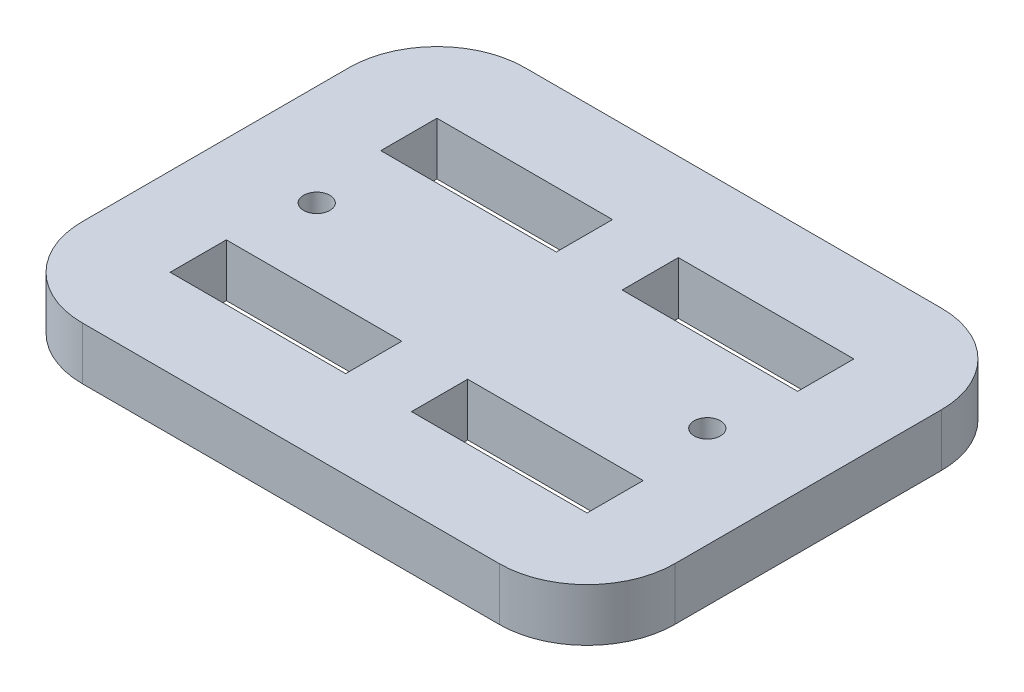
ISO-10303-21;
HEADER;
FILE_DESCRIPTION(('STEP AP214'),'2;1');
FILE_NAME('part.step','',(''),(''),'','','');
FILE_SCHEMA(('AUTOMOTIVE_DESIGN { 1 0 10303 214 1 1 1 1 }'));
ENDSEC;
DATA;
#1=APPLICATION_CONTEXT('core data for automotive mechanical design processes');
#2=APPLICATION_PROTOCOL_DEFINITION('international standard','automotive_design',2000,#1);
#3=PRODUCT_CONTEXT('',#1,'mechanical');
#4=PRODUCT('Part','Part','',(#3));
#5=PRODUCT_RELATED_PRODUCT_CATEGORY('part','',(#4));
#6=PRODUCT_DEFINITION_FORMATION('','',#4);
#7=PRODUCT_DEFINITION_CONTEXT('part definition',#1,'design');
#8=PRODUCT_DEFINITION('design','',#6,#7);
#9=PRODUCT_DEFINITION_SHAPE('','',#8);
#10=(LENGTH_UNIT() NAMED_UNIT(*) SI_UNIT(.MILLI.,.METRE.));
#11=(NAMED_UNIT(*) PLANE_ANGLE_UNIT() SI_UNIT($,.RADIAN.));
#12=(NAMED_UNIT(*) SI_UNIT($,.STERADIAN.) SOLID_ANGLE_UNIT());
#13=UNCERTAINTY_MEASURE_WITH_UNIT(LENGTH_MEASURE(1.E-05),#10,'distance_accuracy_value','');
#14=(GEOMETRIC_REPRESENTATION_CONTEXT(3) GLOBAL_UNCERTAINTY_ASSIGNED_CONTEXT((#13)) GLOBAL_UNIT_ASSIGNED_CONTEXT((#10,
#11,#12)) REPRESENTATION_CONTEXT('',''));
#15=CARTESIAN_POINT('',(0.,0.,0.));
#16=DIRECTION('',(0.,0.,1.));
#17=DIRECTION('',(1.,0.,0.));
#18=AXIS2_PLACEMENT_3D('',#15,#16,#17);
#19=CARTESIAN_POINT('',(0.,6.,0.));
#20=DIRECTION('',(0.,1.,0.));
#21=DIRECTION('',(0.,0.,1.));
#22=AXIS2_PLACEMENT_3D('',#19,#20,#21);
#23=PLANE('',#22);
#24=DIRECTION('',(1.,0.,0.));
#25=VECTOR('',#24,1.);
#26=CARTESIAN_POINT('',(-23.75,6.,15.2));
#27=LINE('',#26,#25);
#28=CARTESIAN_POINT('',(-23.75,6.,15.2));
#29=VERTEX_POINT('',#28);
#30=CARTESIAN_POINT('',(-3.75,6.,15.2));
#31=VERTEX_POINT('',#30);
#32=EDGE_CURVE('E286',#29,#31,#27,.T.);
#33=ORIENTED_EDGE('',*,*,#32,.F.);
#34=DIRECTION('',(0.,0.,1.));
#35=VECTOR('',#34,1.);
#36=CARTESIAN_POINT('',(-23.75,6.,15.2));
#37=LINE('',#36,#35);
#38=CARTESIAN_POINT('',(-23.75,6.,8.8));
#39=VERTEX_POINT('',#38);
#40=EDGE_CURVE('E284',#39,#29,#37,.T.);
#41=ORIENTED_EDGE('',*,*,#40,.F.);
#42=DIRECTION('',(-1.,0.,0.));
#43=VECTOR('',#42,1.);
#44=CARTESIAN_POINT('',(-23.75,6.,8.8));
#45=LINE('',#44,#43);
#46=CARTESIAN_POINT('',(-3.75,6.,8.8));
#47=VERTEX_POINT('',#46);
#48=EDGE_CURVE('E292',#47,#39,#45,.T.);
#49=ORIENTED_EDGE('',*,*,#48,.F.);
#50=DIRECTION('',(0.,0.,-1.));
#51=VECTOR('',#50,1.);
#52=CARTESIAN_POINT('',(-3.75,6.,15.2));
#53=LINE('',#52,#51);
#54=EDGE_CURVE('E289',#31,#47,#53,.T.);
#55=ORIENTED_EDGE('',*,*,#54,.F.);
#56=EDGE_LOOP('',(#33,#41,#49,#55));
#57=FACE_BOUND('',#56,.T.);
#58=DIRECTION('',(-1.,0.,0.));
#59=VECTOR('',#58,1.);
#60=CARTESIAN_POINT('',(-23.75,6.,-15.2));
#61=LINE('',#60,#59);
#62=CARTESIAN_POINT('',(-3.75,6.,-15.2));
#63=VERTEX_POINT('',#62);
#64=CARTESIAN_POINT('',(-23.75,6.,-15.2));
#65=VERTEX_POINT('',#64);
#66=EDGE_CURVE('E317',#63,#65,#61,.T.);
#67=ORIENTED_EDGE('',*,*,#66,.F.);
#68=DIRECTION('',(0.,0.,-1.));
#69=VECTOR('',#68,1.);
#70=CARTESIAN_POINT('',(-3.75,6.,-15.2));
#71=LINE('',#70,#69);
#72=CARTESIAN_POINT('',(-3.75,6.,-8.8));
#73=VERTEX_POINT('',#72);
#74=EDGE_CURVE('E315',#73,#63,#71,.T.);
#75=ORIENTED_EDGE('',*,*,#74,.F.);
#76=DIRECTION('',(1.,0.,0.));
#77=VECTOR('',#76,1.);
#78=CARTESIAN_POINT('',(-23.75,6.,-8.8));
#79=LINE('',#78,#77);
#80=CARTESIAN_POINT('',(-23.75,6.,-8.8));
#81=VERTEX_POINT('',#80);
#82=EDGE_CURVE('E323',#81,#73,#79,.T.);
#83=ORIENTED_EDGE('',*,*,#82,.F.);
#84=DIRECTION('',(0.,0.,1.));
#85=VECTOR('',#84,1.);
#86=CARTESIAN_POINT('',(-23.75,6.,-15.2));
#87=LINE('',#86,#85);
#88=EDGE_CURVE('E320',#65,#81,#87,.T.);
#89=ORIENTED_EDGE('',*,*,#88,.F.);
#90=EDGE_LOOP('',(#67,#75,#83,#89));
#91=FACE_BOUND('',#90,.T.);
#92=DIRECTION('',(1.,0.,0.));
#93=VECTOR('',#92,1.);
#94=CARTESIAN_POINT('',(-33.75,6.,25.2));
#95=LINE('',#94,#93);
#96=CARTESIAN_POINT('',(-23.75,6.,25.2));
#97=VERTEX_POINT('',#96);
#98=CARTESIAN_POINT('',(23.75,6.,25.2));
#99=VERTEX_POINT('',#98);
#100=EDGE_CURVE('E349',#97,#99,#95,.T.);
#101=ORIENTED_EDGE('',*,*,#100,.T.);
#102=CARTESIAN_POINT('',(23.75,6.,15.2));
#103=DIRECTION('',(0.,1.,0.));
#104=DIRECTION('',(0.,0.,1.));
#105=AXIS2_PLACEMENT_3D('',#102,#103,#104);
#106=CIRCLE('',#105,10.);
#107=CARTESIAN_POINT('',(33.75,6.,15.2));
#108=VERTEX_POINT('',#107);
#109=EDGE_CURVE('E40',#99,#108,#106,.T.);
#110=ORIENTED_EDGE('',*,*,#109,.T.);
#111=DIRECTION('',(0.,0.,1.));
#112=VECTOR('',#111,1.);
#113=CARTESIAN_POINT('',(33.75,6.,-25.2));
#114=LINE('',#113,#112);
#115=CARTESIAN_POINT('',(33.75,6.,-15.2));
#116=VERTEX_POINT('',#115);
#117=EDGE_CURVE('E272',#116,#108,#114,.T.);
#118=ORIENTED_EDGE('',*,*,#117,.F.);
#119=CARTESIAN_POINT('',(23.75,6.,-15.2));
#120=DIRECTION('',(0.,1.,0.));
#121=DIRECTION('',(0.,0.,1.));
#122=AXIS2_PLACEMENT_3D('',#119,#120,#121);
#123=CIRCLE('',#122,10.);
#124=CARTESIAN_POINT('',(23.75,6.,-25.2));
#125=VERTEX_POINT('',#124);
#126=EDGE_CURVE('E47',#116,#125,#123,.T.);
#127=ORIENTED_EDGE('',*,*,#126,.T.);
#128=DIRECTION('',(-1.,0.,0.));
#129=VECTOR('',#128,1.);
#130=CARTESIAN_POINT('',(-33.75,6.,-25.2));
#131=LINE('',#130,#129);
#132=CARTESIAN_POINT('',(-23.75,6.,-25.2));
#133=VERTEX_POINT('',#132);
#134=EDGE_CURVE('E352',#125,#133,#131,.T.);
#135=ORIENTED_EDGE('',*,*,#134,.T.);
#136=CARTESIAN_POINT('',(-23.75,6.,-15.2));
#137=DIRECTION('',(0.,1.,0.));
#138=DIRECTION('',(0.,0.,1.));
#139=AXIS2_PLACEMENT_3D('',#136,#137,#138);
#140=CIRCLE('',#139,10.);
#141=CARTESIAN_POINT('',(-33.75,6.,-15.2));
#142=VERTEX_POINT('',#141);
#143=EDGE_CURVE('E372',#133,#142,#140,.T.);
#144=ORIENTED_EDGE('',*,*,#143,.T.);
#145=DIRECTION('',(0.,0.,1.));
#146=VECTOR('',#145,1.);
#147=CARTESIAN_POINT('',(-33.75,6.,-25.2));
#148=LINE('',#147,#146);
#149=CARTESIAN_POINT('',(-33.75,6.,15.2));
#150=VERTEX_POINT('',#149);
#151=EDGE_CURVE('E346',#142,#150,#148,.T.);
#152=ORIENTED_EDGE('',*,*,#151,.T.);
#153=CARTESIAN_POINT('',(-23.75,6.,15.2));
#154=DIRECTION('',(0.,1.,0.));
#155=DIRECTION('',(0.,0.,1.));
#156=AXIS2_PLACEMENT_3D('',#153,#154,#155);
#157=CIRCLE('',#156,10.);
#158=EDGE_CURVE('E374',#150,#97,#157,.T.);
#159=ORIENTED_EDGE('',*,*,#158,.T.);
#160=EDGE_LOOP('',(#101,#110,#118,#127,#135,#144,#152,#159));
#161=FACE_BOUND('',#160,.T.);
#162=CARTESIAN_POINT('',(-22.25,6.,0.));
#163=DIRECTION('',(0.,1.,0.));
#164=DIRECTION('',(0.,0.,-1.));
#165=AXIS2_PLACEMENT_3D('',#162,#163,#164);
#166=CIRCLE('',#165,1.5);
#167=CARTESIAN_POINT('',(-22.25,6.,-1.5));
#168=VERTEX_POINT('',#167);
#169=EDGE_CURVE('E278',#168,#168,#166,.T.);
#170=ORIENTED_EDGE('',*,*,#169,.F.);
#171=EDGE_LOOP('',(#170));
#172=FACE_BOUND('',#171,.T.);
#173=CARTESIAN_POINT('',(22.25,6.,0.));
#174=DIRECTION('',(0.,-1.,0.));
#175=DIRECTION('',(0.,0.,-1.));
#176=AXIS2_PLACEMENT_3D('',#173,#174,#175);
#177=CIRCLE('',#176,1.5);
#178=CARTESIAN_POINT('',(22.25,6.,-1.5));
#179=VERTEX_POINT('',#178);
#180=EDGE_CURVE('E229',#179,#179,#177,.T.);
#181=ORIENTED_EDGE('',*,*,#180,.T.);
#182=EDGE_LOOP('',(#181));
#183=FACE_BOUND('',#182,.T.);
#184=DIRECTION('',(0.,0.,1.));
#185=VECTOR('',#184,1.);
#186=CARTESIAN_POINT('',(23.75,6.,15.2));
#187=LINE('',#186,#185);
#188=CARTESIAN_POINT('',(23.75,6.,8.8));
#189=VERTEX_POINT('',#188);
#190=CARTESIAN_POINT('',(23.75,6.,15.2));
#191=VERTEX_POINT('',#190);
#192=EDGE_CURVE('E210',#189,#191,#187,.T.);
#193=ORIENTED_EDGE('',*,*,#192,.T.);
#194=DIRECTION('',(-1.,0.,0.));
#195=VECTOR('',#194,1.);
#196=CARTESIAN_POINT('',(23.75,6.,15.2));
#197=LINE('',#196,#195);
#198=CARTESIAN_POINT('',(3.75,6.,15.2));
#199=VERTEX_POINT('',#198);
#200=EDGE_CURVE('E222',#191,#199,#197,.T.);
#201=ORIENTED_EDGE('',*,*,#200,.T.);
#202=DIRECTION('',(0.,0.,-1.));
#203=VECTOR('',#202,1.);
#204=CARTESIAN_POINT('',(3.75,6.,15.2));
#205=LINE('',#204,#203);
#206=CARTESIAN_POINT('',(3.75,6.,8.8));
#207=VERTEX_POINT('',#206);
#208=EDGE_CURVE('E220',#199,#207,#205,.T.);
#209=ORIENTED_EDGE('',*,*,#208,.T.);
#210=DIRECTION('',(1.,0.,0.));
#211=VECTOR('',#210,1.);
#212=CARTESIAN_POINT('',(23.75,6.,8.8));
#213=LINE('',#212,#211);
#214=EDGE_CURVE('E200',#207,#189,#213,.T.);
#215=ORIENTED_EDGE('',*,*,#214,.T.);
#216=EDGE_LOOP('',(#193,#201,#209,#215));
#217=FACE_BOUND('',#216,.T.);
#218=DIRECTION('',(0.,0.,-1.));
#219=VECTOR('',#218,1.);
#220=CARTESIAN_POINT('',(3.75,6.,-15.2));
#221=LINE('',#220,#219);
#222=CARTESIAN_POINT('',(3.75,6.,-8.8));
#223=VERTEX_POINT('',#222);
#224=CARTESIAN_POINT('',(3.75,6.,-15.2));
#225=VERTEX_POINT('',#224);
#226=EDGE_CURVE('E240',#223,#225,#221,.T.);
#227=ORIENTED_EDGE('',*,*,#226,.T.);
#228=DIRECTION('',(1.,0.,0.));
#229=VECTOR('',#228,1.);
#230=CARTESIAN_POINT('',(23.75,6.,-15.2));
#231=LINE('',#230,#229);
#232=CARTESIAN_POINT('',(23.75,6.,-15.2));
#233=VERTEX_POINT('',#232);
#234=EDGE_CURVE('E250',#225,#233,#231,.T.);
#235=ORIENTED_EDGE('',*,*,#234,.T.);
#236=DIRECTION('',(0.,0.,1.));
#237=VECTOR('',#236,1.);
#238=CARTESIAN_POINT('',(23.75,6.,-15.2));
#239=LINE('',#238,#237);
#240=CARTESIAN_POINT('',(23.75,6.,-8.8));
#241=VERTEX_POINT('',#240);
#242=EDGE_CURVE('E247',#233,#241,#239,.T.);
#243=ORIENTED_EDGE('',*,*,#242,.T.);
#244=DIRECTION('',(-1.,0.,0.));
#245=VECTOR('',#244,1.);
#246=CARTESIAN_POINT('',(23.75,6.,-8.8));
#247=LINE('',#246,#245);
#248=EDGE_CURVE('E243',#241,#223,#247,.T.);
#249=ORIENTED_EDGE('',*,*,#248,.T.);
#250=EDGE_LOOP('',(#227,#235,#243,#249));
#251=FACE_BOUND('',#250,.T.);
#252=ADVANCED_FACE('F32',(#57,#91,#161,#172,#183,#217,#251),#23,.T.);
#253=CARTESIAN_POINT('',(0.,0.,0.));
#254=DIRECTION('',(0.,1.,0.));
#255=DIRECTION('',(0.,0.,1.));
#256=AXIS2_PLACEMENT_3D('',#253,#254,#255);
#257=PLANE('',#256);
#258=DIRECTION('',(0.,0.,-1.));
#259=VECTOR('',#258,1.);
#260=CARTESIAN_POINT('',(-3.75,0.,-15.2));
#261=LINE('',#260,#259);
#262=CARTESIAN_POINT('',(-3.75,0.,-8.8));
#263=VERTEX_POINT('',#262);
#264=CARTESIAN_POINT('',(-3.75,0.,-15.2));
#265=VERTEX_POINT('',#264);
#266=EDGE_CURVE('E314',#263,#265,#261,.T.);
#267=ORIENTED_EDGE('',*,*,#266,.T.);
#268=DIRECTION('',(-1.,0.,0.));
#269=VECTOR('',#268,1.);
#270=CARTESIAN_POINT('',(-23.75,0.,-15.2));
#271=LINE('',#270,#269);
#272=CARTESIAN_POINT('',(-23.75,0.,-15.2));
#273=VERTEX_POINT('',#272);
#274=EDGE_CURVE('E328',#265,#273,#271,.T.);
#275=ORIENTED_EDGE('',*,*,#274,.T.);
#276=DIRECTION('',(0.,0.,1.));
#277=VECTOR('',#276,1.);
#278=CARTESIAN_POINT('',(-23.75,0.,-15.2));
#279=LINE('',#278,#277);
#280=CARTESIAN_POINT('',(-23.75,0.,-8.8));
#281=VERTEX_POINT('',#280);
#282=EDGE_CURVE('E331',#273,#281,#279,.T.);
#283=ORIENTED_EDGE('',*,*,#282,.T.);
#284=DIRECTION('',(1.,0.,0.));
#285=VECTOR('',#284,1.);
#286=CARTESIAN_POINT('',(-23.75,0.,-8.8));
#287=LINE('',#286,#285);
#288=EDGE_CURVE('E318',#281,#263,#287,.T.);
#289=ORIENTED_EDGE('',*,*,#288,.T.);
#290=EDGE_LOOP('',(#267,#275,#283,#289));
#291=FACE_BOUND('',#290,.T.);
#292=DIRECTION('',(0.,0.,1.));
#293=VECTOR('',#292,1.);
#294=CARTESIAN_POINT('',(33.75,0.,-25.2));
#295=LINE('',#294,#293);
#296=CARTESIAN_POINT('',(33.75,0.,-15.2));
#297=VERTEX_POINT('',#296);
#298=CARTESIAN_POINT('',(33.75,0.,15.2));
#299=VERTEX_POINT('',#298);
#300=EDGE_CURVE('E271',#297,#299,#295,.T.);
#301=ORIENTED_EDGE('',*,*,#300,.T.);
#302=CARTESIAN_POINT('',(23.75,0.,15.2));
#303=DIRECTION('',(0.,1.,0.));
#304=DIRECTION('',(0.,0.,1.));
#305=AXIS2_PLACEMENT_3D('',#302,#303,#304);
#306=CIRCLE('',#305,10.);
#307=CARTESIAN_POINT('',(23.75,0.,25.2));
#308=VERTEX_POINT('',#307);
#309=EDGE_CURVE('E386',#299,#308,#306,.F.);
#310=ORIENTED_EDGE('',*,*,#309,.T.);
#311=DIRECTION('',(1.,0.,0.));
#312=VECTOR('',#311,1.);
#313=CARTESIAN_POINT('',(-33.75,0.,25.2));
#314=LINE('',#313,#312);
#315=CARTESIAN_POINT('',(-23.75,0.,25.2));
#316=VERTEX_POINT('',#315);
#317=EDGE_CURVE('E357',#316,#308,#314,.T.);
#318=ORIENTED_EDGE('',*,*,#317,.F.);
#319=CARTESIAN_POINT('',(-23.75,0.,15.2));
#320=DIRECTION('',(0.,1.,0.));
#321=DIRECTION('',(0.,0.,1.));
#322=AXIS2_PLACEMENT_3D('',#319,#320,#321);
#323=CIRCLE('',#322,10.);
#324=CARTESIAN_POINT('',(-33.75,0.,15.2));
#325=VERTEX_POINT('',#324);
#326=EDGE_CURVE('E365',#316,#325,#323,.F.);
#327=ORIENTED_EDGE('',*,*,#326,.T.);
#328=DIRECTION('',(0.,0.,1.));
#329=VECTOR('',#328,1.);
#330=CARTESIAN_POINT('',(-33.75,0.,-25.2));
#331=LINE('',#330,#329);
#332=CARTESIAN_POINT('',(-33.75,0.,-15.2));
#333=VERTEX_POINT('',#332);
#334=EDGE_CURVE('E345',#333,#325,#331,.T.);
#335=ORIENTED_EDGE('',*,*,#334,.F.);
#336=CARTESIAN_POINT('',(-23.75,0.,-15.2));
#337=DIRECTION('',(0.,1.,0.));
#338=DIRECTION('',(0.,0.,1.));
#339=AXIS2_PLACEMENT_3D('',#336,#337,#338);
#340=CIRCLE('',#339,10.);
#341=CARTESIAN_POINT('',(-23.75,0.,-25.2));
#342=VERTEX_POINT('',#341);
#343=EDGE_CURVE('E362',#333,#342,#340,.F.);
#344=ORIENTED_EDGE('',*,*,#343,.T.);
#345=DIRECTION('',(-1.,0.,0.));
#346=VECTOR('',#345,1.);
#347=CARTESIAN_POINT('',(-33.75,0.,-25.2));
#348=LINE('',#347,#346);
#349=CARTESIAN_POINT('',(23.75,0.,-25.2));
#350=VERTEX_POINT('',#349);
#351=EDGE_CURVE('E350',#350,#342,#348,.T.);
#352=ORIENTED_EDGE('',*,*,#351,.F.);
#353=CARTESIAN_POINT('',(23.75,0.,-15.2));
#354=DIRECTION('',(0.,1.,0.));
#355=DIRECTION('',(0.,0.,1.));
#356=AXIS2_PLACEMENT_3D('',#353,#354,#355);
#357=CIRCLE('',#356,10.);
#358=EDGE_CURVE('E384',#350,#297,#357,.F.);
#359=ORIENTED_EDGE('',*,*,#358,.T.);
#360=EDGE_LOOP('',(#301,#310,#318,#327,#335,#344,#352,#359));
#361=FACE_BOUND('',#360,.T.);
#362=DIRECTION('',(0.,0.,1.));
#363=VECTOR('',#362,1.);
#364=CARTESIAN_POINT('',(-23.75,0.,15.2));
#365=LINE('',#364,#363);
#366=CARTESIAN_POINT('',(-23.75,0.,8.8));
#367=VERTEX_POINT('',#366);
#368=CARTESIAN_POINT('',(-23.75,0.,15.2));
#369=VERTEX_POINT('',#368);
#370=EDGE_CURVE('E281',#367,#369,#365,.T.);
#371=ORIENTED_EDGE('',*,*,#370,.T.);
#372=DIRECTION('',(1.,0.,0.));
#373=VECTOR('',#372,1.);
#374=CARTESIAN_POINT('',(-23.75,0.,15.2));
#375=LINE('',#374,#373);
#376=CARTESIAN_POINT('',(-3.75,0.,15.2));
#377=VERTEX_POINT('',#376);
#378=EDGE_CURVE('E297',#369,#377,#375,.T.);
#379=ORIENTED_EDGE('',*,*,#378,.T.);
#380=DIRECTION('',(0.,0.,-1.));
#381=VECTOR('',#380,1.);
#382=CARTESIAN_POINT('',(-3.75,0.,15.2));
#383=LINE('',#382,#381);
#384=CARTESIAN_POINT('',(-3.75,0.,8.8));
#385=VERTEX_POINT('',#384);
#386=EDGE_CURVE('E300',#377,#385,#383,.T.);
#387=ORIENTED_EDGE('',*,*,#386,.T.);
#388=DIRECTION('',(-1.,0.,0.));
#389=VECTOR('',#388,1.);
#390=CARTESIAN_POINT('',(-23.75,0.,8.8));
#391=LINE('',#390,#389);
#392=EDGE_CURVE('E287',#385,#367,#391,.T.);
#393=ORIENTED_EDGE('',*,*,#392,.T.);
#394=EDGE_LOOP('',(#371,#379,#387,#393));
#395=FACE_BOUND('',#394,.T.);
#396=CARTESIAN_POINT('',(-22.25,0.,0.));
#397=DIRECTION('',(0.,1.,0.));
#398=DIRECTION('',(0.,0.,-1.));
#399=AXIS2_PLACEMENT_3D('',#396,#397,#398);
#400=CIRCLE('',#399,1.5);
#401=CARTESIAN_POINT('',(-22.25,0.,-1.5));
#402=VERTEX_POINT('',#401);
#403=EDGE_CURVE('E275',#402,#402,#400,.T.);
#404=ORIENTED_EDGE('',*,*,#403,.T.);
#405=EDGE_LOOP('',(#404));
#406=FACE_BOUND('',#405,.T.);
#407=CARTESIAN_POINT('',(22.25,0.,0.));
#408=DIRECTION('',(0.,-1.,0.));
#409=DIRECTION('',(0.,0.,-1.));
#410=AXIS2_PLACEMENT_3D('',#407,#408,#409);
#411=CIRCLE('',#410,1.5);
#412=CARTESIAN_POINT('',(22.25,0.,-1.5));
#413=VERTEX_POINT('',#412);
#414=EDGE_CURVE('E694',#413,#413,#411,.T.);
#415=ORIENTED_EDGE('',*,*,#414,.F.);
#416=EDGE_LOOP('',(#415));
#417=FACE_BOUND('',#416,.T.);
#418=DIRECTION('',(-1.,0.,0.));
#419=VECTOR('',#418,1.);
#420=CARTESIAN_POINT('',(23.75,0.,15.2));
#421=LINE('',#420,#419);
#422=CARTESIAN_POINT('',(23.75,0.,15.2));
#423=VERTEX_POINT('',#422);
#424=CARTESIAN_POINT('',(3.75,0.,15.2));
#425=VERTEX_POINT('',#424);
#426=EDGE_CURVE('E217',#423,#425,#421,.T.);
#427=ORIENTED_EDGE('',*,*,#426,.F.);
#428=DIRECTION('',(0.,0.,1.));
#429=VECTOR('',#428,1.);
#430=CARTESIAN_POINT('',(23.75,0.,15.2));
#431=LINE('',#430,#429);
#432=CARTESIAN_POINT('',(23.75,0.,8.8));
#433=VERTEX_POINT('',#432);
#434=EDGE_CURVE('E227',#433,#423,#431,.T.);
#435=ORIENTED_EDGE('',*,*,#434,.F.);
#436=DIRECTION('',(1.,0.,0.));
#437=VECTOR('',#436,1.);
#438=CARTESIAN_POINT('',(23.75,0.,8.8));
#439=LINE('',#438,#437);
#440=CARTESIAN_POINT('',(3.75,0.,8.8));
#441=VERTEX_POINT('',#440);
#442=EDGE_CURVE('E203',#441,#433,#439,.T.);
#443=ORIENTED_EDGE('',*,*,#442,.F.);
#444=DIRECTION('',(0.,0.,-1.));
#445=VECTOR('',#444,1.);
#446=CARTESIAN_POINT('',(3.75,0.,15.2));
#447=LINE('',#446,#445);
#448=EDGE_CURVE('E231',#425,#441,#447,.T.);
#449=ORIENTED_EDGE('',*,*,#448,.F.);
#450=EDGE_LOOP('',(#427,#435,#443,#449));
#451=FACE_BOUND('',#450,.T.);
#452=DIRECTION('',(1.,0.,0.));
#453=VECTOR('',#452,1.);
#454=CARTESIAN_POINT('',(23.75,0.,-15.2));
#455=LINE('',#454,#453);
#456=CARTESIAN_POINT('',(3.75,0.,-15.2));
#457=VERTEX_POINT('',#456);
#458=CARTESIAN_POINT('',(23.75,0.,-15.2));
#459=VERTEX_POINT('',#458);
#460=EDGE_CURVE('E244',#457,#459,#455,.T.);
#461=ORIENTED_EDGE('',*,*,#460,.F.);
#462=DIRECTION('',(0.,0.,-1.));
#463=VECTOR('',#462,1.);
#464=CARTESIAN_POINT('',(3.75,0.,-15.2));
#465=LINE('',#464,#463);
#466=CARTESIAN_POINT('',(3.75,0.,-8.8));
#467=VERTEX_POINT('',#466);
#468=EDGE_CURVE('E206',#467,#457,#465,.T.);
#469=ORIENTED_EDGE('',*,*,#468,.F.);
#470=DIRECTION('',(-1.,0.,0.));
#471=VECTOR('',#470,1.);
#472=CARTESIAN_POINT('',(23.75,0.,-8.8));
#473=LINE('',#472,#471);
#474=CARTESIAN_POINT('',(23.75,0.,-8.8));
#475=VERTEX_POINT('',#474);
#476=EDGE_CURVE('E255',#475,#467,#473,.T.);
#477=ORIENTED_EDGE('',*,*,#476,.F.);
#478=DIRECTION('',(0.,0.,1.));
#479=VECTOR('',#478,1.);
#480=CARTESIAN_POINT('',(23.75,0.,-15.2));
#481=LINE('',#480,#479);
#482=EDGE_CURVE('E258',#459,#475,#481,.T.);
#483=ORIENTED_EDGE('',*,*,#482,.F.);
#484=EDGE_LOOP('',(#461,#469,#477,#483));
#485=FACE_BOUND('',#484,.T.);
#486=ADVANCED_FACE('F400',(#291,#361,#395,#406,#417,#451,#485),#257,.F.);
#487=CARTESIAN_POINT('',(-33.75,6.,-25.2));
#488=DIRECTION('',(1.,0.,0.));
#489=DIRECTION('',(0.,0.,-1.));
#490=AXIS2_PLACEMENT_3D('',#487,#488,#489);
#491=PLANE('',#490);
#492=ORIENTED_EDGE('',*,*,#334,.T.);
#493=DIRECTION('',(0.,-1.,0.));
#494=VECTOR('',#493,1.);
#495=CARTESIAN_POINT('',(-33.75,6.,15.2));
#496=LINE('',#495,#494);
#497=EDGE_CURVE('E370',#325,#150,#496,.F.);
#498=ORIENTED_EDGE('',*,*,#497,.T.);
#499=ORIENTED_EDGE('',*,*,#151,.F.);
#500=DIRECTION('',(0.,-1.,0.));
#501=VECTOR('',#500,1.);
#502=CARTESIAN_POINT('',(-33.75,6.,-15.2));
#503=LINE('',#502,#501);
#504=EDGE_CURVE('E367',#142,#333,#503,.T.);
#505=ORIENTED_EDGE('',*,*,#504,.T.);
#506=EDGE_LOOP('',(#492,#498,#499,#505));
#507=FACE_BOUND('',#506,.T.);
#508=ADVANCED_FACE('F410',(#507),#491,.F.);
#509=CARTESIAN_POINT('',(-33.75,6.,25.2));
#510=DIRECTION('',(0.,0.,-1.));
#511=DIRECTION('',(-1.,0.,0.));
#512=AXIS2_PLACEMENT_3D('',#509,#510,#511);
#513=PLANE('',#512);
#514=ORIENTED_EDGE('',*,*,#317,.T.);
#515=DIRECTION('',(0.,-1.,0.));
#516=VECTOR('',#515,1.);
#517=CARTESIAN_POINT('',(23.75,6.,25.2));
#518=LINE('',#517,#516);
#519=EDGE_CURVE('E55',#308,#99,#518,.F.);
#520=ORIENTED_EDGE('',*,*,#519,.T.);
#521=ORIENTED_EDGE('',*,*,#100,.F.);
#522=DIRECTION('',(0.,-1.,0.));
#523=VECTOR('',#522,1.);
#524=CARTESIAN_POINT('',(-23.75,6.,25.2));
#525=LINE('',#524,#523);
#526=EDGE_CURVE('E354',#97,#316,#525,.T.);
#527=ORIENTED_EDGE('',*,*,#526,.T.);
#528=EDGE_LOOP('',(#514,#520,#521,#527));
#529=FACE_BOUND('',#528,.T.);
#530=ADVANCED_FACE('F402',(#529),#513,.F.);
#531=CARTESIAN_POINT('',(-33.75,6.,-25.2));
#532=DIRECTION('',(0.,0.,1.));
#533=DIRECTION('',(1.,0.,0.));
#534=AXIS2_PLACEMENT_3D('',#531,#532,#533);
#535=PLANE('',#534);
#536=ORIENTED_EDGE('',*,*,#134,.F.);
#537=DIRECTION('',(0.,-1.,0.));
#538=VECTOR('',#537,1.);
#539=CARTESIAN_POINT('',(23.75,0.,-25.2));
#540=LINE('',#539,#538);
#541=EDGE_CURVE('E11',#125,#350,#540,.T.);
#542=ORIENTED_EDGE('',*,*,#541,.T.);
#543=ORIENTED_EDGE('',*,*,#351,.T.);
#544=DIRECTION('',(0.,-1.,0.));
#545=VECTOR('',#544,1.);
#546=CARTESIAN_POINT('',(-23.75,6.,-25.2));
#547=LINE('',#546,#545);
#548=EDGE_CURVE('E376',#342,#133,#547,.F.);
#549=ORIENTED_EDGE('',*,*,#548,.T.);
#550=EDGE_LOOP('',(#536,#542,#543,#549));
#551=FACE_BOUND('',#550,.T.);
#552=ADVANCED_FACE('F419',(#551),#535,.F.);
#553=CARTESIAN_POINT('',(-3.75,6.,-15.2));
#554=DIRECTION('',(-1.,0.,0.));
#555=DIRECTION('',(0.,0.,1.));
#556=AXIS2_PLACEMENT_3D('',#553,#554,#555);
#557=PLANE('',#556);
#558=ORIENTED_EDGE('',*,*,#266,.F.);
#559=DIRECTION('',(0.,-1.,0.));
#560=VECTOR('',#559,1.);
#561=CARTESIAN_POINT('',(-3.75,6.,-8.8));
#562=LINE('',#561,#560);
#563=EDGE_CURVE('E325',#73,#263,#562,.T.);
#564=ORIENTED_EDGE('',*,*,#563,.F.);
#565=ORIENTED_EDGE('',*,*,#74,.T.);
#566=DIRECTION('',(0.,-1.,0.));
#567=VECTOR('',#566,1.);
#568=CARTESIAN_POINT('',(-3.75,6.,-15.2));
#569=LINE('',#568,#567);
#570=EDGE_CURVE('E342',#63,#265,#569,.T.);
#571=ORIENTED_EDGE('',*,*,#570,.T.);
#572=EDGE_LOOP('',(#558,#564,#565,#571));
#573=FACE_BOUND('',#572,.T.);
#574=ADVANCED_FACE('F438',(#573),#557,.T.);
#575=CARTESIAN_POINT('',(-23.75,6.,-15.2));
#576=DIRECTION('',(0.,0.,1.));
#577=DIRECTION('',(1.,0.,0.));
#578=AXIS2_PLACEMENT_3D('',#575,#576,#577);
#579=PLANE('',#578);
#580=ORIENTED_EDGE('',*,*,#274,.F.);
#581=ORIENTED_EDGE('',*,*,#570,.F.);
#582=ORIENTED_EDGE('',*,*,#66,.T.);
#583=DIRECTION('',(0.,-1.,0.));
#584=VECTOR('',#583,1.);
#585=CARTESIAN_POINT('',(-23.75,6.,-15.2));
#586=LINE('',#585,#584);
#587=EDGE_CURVE('E340',#65,#273,#586,.T.);
#588=ORIENTED_EDGE('',*,*,#587,.T.);
#589=EDGE_LOOP('',(#580,#581,#582,#588));
#590=FACE_BOUND('',#589,.T.);
#591=ADVANCED_FACE('F489',(#590),#579,.T.);
#592=CARTESIAN_POINT('',(-23.75,6.,-15.2));
#593=DIRECTION('',(1.,0.,0.));
#594=DIRECTION('',(0.,0.,-1.));
#595=AXIS2_PLACEMENT_3D('',#592,#593,#594);
#596=PLANE('',#595);
#597=ORIENTED_EDGE('',*,*,#282,.F.);
#598=ORIENTED_EDGE('',*,*,#587,.F.);
#599=ORIENTED_EDGE('',*,*,#88,.T.);
#600=DIRECTION('',(0.,-1.,0.));
#601=VECTOR('',#600,1.);
#602=CARTESIAN_POINT('',(-23.75,6.,-8.8));
#603=LINE('',#602,#601);
#604=EDGE_CURVE('E338',#81,#281,#603,.T.);
#605=ORIENTED_EDGE('',*,*,#604,.T.);
#606=EDGE_LOOP('',(#597,#598,#599,#605));
#607=FACE_BOUND('',#606,.T.);
#608=ADVANCED_FACE('F486',(#607),#596,.T.);
#609=CARTESIAN_POINT('',(-23.75,6.,-8.8));
#610=DIRECTION('',(0.,0.,-1.));
#611=DIRECTION('',(-1.,0.,0.));
#612=AXIS2_PLACEMENT_3D('',#609,#610,#611);
#613=PLANE('',#612);
#614=ORIENTED_EDGE('',*,*,#288,.F.);
#615=ORIENTED_EDGE('',*,*,#604,.F.);
#616=ORIENTED_EDGE('',*,*,#82,.T.);
#617=ORIENTED_EDGE('',*,*,#563,.T.);
#618=EDGE_LOOP('',(#614,#615,#616,#617));
#619=FACE_BOUND('',#618,.T.);
#620=ADVANCED_FACE('F482',(#619),#613,.T.);
#621=CARTESIAN_POINT('',(-23.75,6.,15.2));
#622=DIRECTION('',(1.,0.,0.));
#623=DIRECTION('',(0.,0.,-1.));
#624=AXIS2_PLACEMENT_3D('',#621,#622,#623);
#625=PLANE('',#624);
#626=ORIENTED_EDGE('',*,*,#370,.F.);
#627=DIRECTION('',(0.,-1.,0.));
#628=VECTOR('',#627,1.);
#629=CARTESIAN_POINT('',(-23.75,6.,8.8));
#630=LINE('',#629,#628);
#631=EDGE_CURVE('E294',#39,#367,#630,.T.);
#632=ORIENTED_EDGE('',*,*,#631,.F.);
#633=ORIENTED_EDGE('',*,*,#40,.T.);
#634=DIRECTION('',(0.,-1.,0.));
#635=VECTOR('',#634,1.);
#636=CARTESIAN_POINT('',(-23.75,6.,15.2));
#637=LINE('',#636,#635);
#638=EDGE_CURVE('E311',#29,#369,#637,.T.);
#639=ORIENTED_EDGE('',*,*,#638,.T.);
#640=EDGE_LOOP('',(#626,#632,#633,#639));
#641=FACE_BOUND('',#640,.T.);
#642=ADVANCED_FACE('F478',(#641),#625,.T.);
#643=CARTESIAN_POINT('',(-23.75,6.,15.2));
#644=DIRECTION('',(0.,0.,-1.));
#645=DIRECTION('',(-1.,0.,0.));
#646=AXIS2_PLACEMENT_3D('',#643,#644,#645);
#647=PLANE('',#646);
#648=ORIENTED_EDGE('',*,*,#378,.F.);
#649=ORIENTED_EDGE('',*,*,#638,.F.);
#650=ORIENTED_EDGE('',*,*,#32,.T.);
#651=DIRECTION('',(0.,-1.,0.));
#652=VECTOR('',#651,1.);
#653=CARTESIAN_POINT('',(-3.75,6.,15.2));
#654=LINE('',#653,#652);
#655=EDGE_CURVE('E309',#31,#377,#654,.T.);
#656=ORIENTED_EDGE('',*,*,#655,.T.);
#657=EDGE_LOOP('',(#648,#649,#650,#656));
#658=FACE_BOUND('',#657,.T.);
#659=ADVANCED_FACE('F474',(#658),#647,.T.);
#660=CARTESIAN_POINT('',(-3.75,6.,15.2));
#661=DIRECTION('',(-1.,0.,0.));
#662=DIRECTION('',(0.,0.,1.));
#663=AXIS2_PLACEMENT_3D('',#660,#661,#662);
#664=PLANE('',#663);
#665=ORIENTED_EDGE('',*,*,#386,.F.);
#666=ORIENTED_EDGE('',*,*,#655,.F.);
#667=ORIENTED_EDGE('',*,*,#54,.T.);
#668=DIRECTION('',(0.,-1.,0.));
#669=VECTOR('',#668,1.);
#670=CARTESIAN_POINT('',(-3.75,6.,8.8));
#671=LINE('',#670,#669);
#672=EDGE_CURVE('E307',#47,#385,#671,.T.);
#673=ORIENTED_EDGE('',*,*,#672,.T.);
#674=EDGE_LOOP('',(#665,#666,#667,#673));
#675=FACE_BOUND('',#674,.T.);
#676=ADVANCED_FACE('F470',(#675),#664,.T.);
#677=CARTESIAN_POINT('',(-23.75,6.,8.8));
#678=DIRECTION('',(0.,0.,1.));
#679=DIRECTION('',(1.,0.,0.));
#680=AXIS2_PLACEMENT_3D('',#677,#678,#679);
#681=PLANE('',#680);
#682=ORIENTED_EDGE('',*,*,#392,.F.);
#683=ORIENTED_EDGE('',*,*,#672,.F.);
#684=ORIENTED_EDGE('',*,*,#48,.T.);
#685=ORIENTED_EDGE('',*,*,#631,.T.);
#686=EDGE_LOOP('',(#682,#683,#684,#685));
#687=FACE_BOUND('',#686,.T.);
#688=ADVANCED_FACE('F466',(#687),#681,.T.);
#689=CARTESIAN_POINT('',(-22.25,6.,0.));
#690=DIRECTION('',(0.,-1.,0.));
#691=DIRECTION('',(0.,0.,-1.));
#692=AXIS2_PLACEMENT_3D('',#689,#690,#691);
#693=CYLINDRICAL_SURFACE('',#692,1.5);
#694=ORIENTED_EDGE('',*,*,#169,.T.);
#695=EDGE_LOOP('',(#694));
#696=FACE_BOUND('',#695,.T.);
#697=ORIENTED_EDGE('',*,*,#403,.F.);
#698=EDGE_LOOP('',(#697));
#699=FACE_BOUND('',#698,.T.);
#700=ADVANCED_FACE('F449',(#696,#699),#693,.F.);
#701=CARTESIAN_POINT('',(-23.75,6.,15.2));
#702=DIRECTION('',(0.,-1.,0.));
#703=DIRECTION('',(0.,0.,-1.));
#704=AXIS2_PLACEMENT_3D('',#701,#702,#703);
#705=CYLINDRICAL_SURFACE('',#704,10.);
#706=ORIENTED_EDGE('',*,*,#158,.F.);
#707=ORIENTED_EDGE('',*,*,#497,.F.);
#708=ORIENTED_EDGE('',*,*,#326,.F.);
#709=ORIENTED_EDGE('',*,*,#526,.F.);
#710=EDGE_LOOP('',(#706,#707,#708,#709));
#711=FACE_BOUND('',#710,.T.);
#712=ADVANCED_FACE('F406',(#711),#705,.T.);
#713=CARTESIAN_POINT('',(-23.75,6.,-15.2));
#714=DIRECTION('',(0.,-1.,0.));
#715=DIRECTION('',(0.,0.,-1.));
#716=AXIS2_PLACEMENT_3D('',#713,#714,#715);
#717=CYLINDRICAL_SURFACE('',#716,10.);
#718=ORIENTED_EDGE('',*,*,#143,.F.);
#719=ORIENTED_EDGE('',*,*,#548,.F.);
#720=ORIENTED_EDGE('',*,*,#343,.F.);
#721=ORIENTED_EDGE('',*,*,#504,.F.);
#722=EDGE_LOOP('',(#718,#719,#720,#721));
#723=FACE_BOUND('',#722,.T.);
#724=ADVANCED_FACE('F415',(#723),#717,.T.);
#725=CARTESIAN_POINT('',(33.75,6.,-25.2));
#726=DIRECTION('',(1.,0.,0.));
#727=DIRECTION('',(0.,0.,-1.));
#728=AXIS2_PLACEMENT_3D('',#725,#726,#727);
#729=PLANE('',#728);
#730=ORIENTED_EDGE('',*,*,#117,.T.);
#731=DIRECTION('',(0.,-1.,0.));
#732=VECTOR('',#731,1.);
#733=CARTESIAN_POINT('',(33.75,0.,15.2));
#734=LINE('',#733,#732);
#735=EDGE_CURVE('E381',#108,#299,#734,.T.);
#736=ORIENTED_EDGE('',*,*,#735,.T.);
#737=ORIENTED_EDGE('',*,*,#300,.F.);
#738=DIRECTION('',(0.,-1.,0.));
#739=VECTOR('',#738,1.);
#740=CARTESIAN_POINT('',(33.75,6.,-15.2));
#741=LINE('',#740,#739);
#742=EDGE_CURVE('E379',#297,#116,#741,.F.);
#743=ORIENTED_EDGE('',*,*,#742,.T.);
#744=EDGE_LOOP('',(#730,#736,#737,#743));
#745=FACE_BOUND('',#744,.T.);
#746=ADVANCED_FACE('F394',(#745),#729,.T.);
#747=CARTESIAN_POINT('',(3.75,6.,-15.2));
#748=DIRECTION('',(-1.,0.,0.));
#749=DIRECTION('',(0.,0.,1.));
#750=AXIS2_PLACEMENT_3D('',#747,#748,#749);
#751=PLANE('',#750);
#752=ORIENTED_EDGE('',*,*,#468,.T.);
#753=DIRECTION('',(0.,-1.,0.));
#754=VECTOR('',#753,1.);
#755=CARTESIAN_POINT('',(3.75,6.,-15.2));
#756=LINE('',#755,#754);
#757=EDGE_CURVE('E253',#225,#457,#756,.T.);
#758=ORIENTED_EDGE('',*,*,#757,.F.);
#759=ORIENTED_EDGE('',*,*,#226,.F.);
#760=DIRECTION('',(0.,-1.,0.));
#761=VECTOR('',#760,1.);
#762=CARTESIAN_POINT('',(3.75,6.,-8.8));
#763=LINE('',#762,#761);
#764=EDGE_CURVE('E269',#223,#467,#763,.T.);
#765=ORIENTED_EDGE('',*,*,#764,.T.);
#766=EDGE_LOOP('',(#752,#758,#759,#765));
#767=FACE_BOUND('',#766,.T.);
#768=ADVANCED_FACE('F454',(#767),#751,.F.);
#769=CARTESIAN_POINT('',(23.75,6.,-8.8));
#770=DIRECTION('',(0.,0.,1.));
#771=DIRECTION('',(1.,0.,0.));
#772=AXIS2_PLACEMENT_3D('',#769,#770,#771);
#773=PLANE('',#772);
#774=ORIENTED_EDGE('',*,*,#476,.T.);
#775=ORIENTED_EDGE('',*,*,#764,.F.);
#776=ORIENTED_EDGE('',*,*,#248,.F.);
#777=DIRECTION('',(0.,-1.,0.));
#778=VECTOR('',#777,1.);
#779=CARTESIAN_POINT('',(23.75,6.,-8.8));
#780=LINE('',#779,#778);
#781=EDGE_CURVE('E267',#241,#475,#780,.T.);
#782=ORIENTED_EDGE('',*,*,#781,.T.);
#783=EDGE_LOOP('',(#774,#775,#776,#782));
#784=FACE_BOUND('',#783,.T.);
#785=ADVANCED_FACE('F459',(#784),#773,.F.);
#786=CARTESIAN_POINT('',(23.75,6.,-15.2));
#787=DIRECTION('',(1.,0.,0.));
#788=DIRECTION('',(0.,0.,-1.));
#789=AXIS2_PLACEMENT_3D('',#786,#787,#788);
#790=PLANE('',#789);
#791=ORIENTED_EDGE('',*,*,#482,.T.);
#792=ORIENTED_EDGE('',*,*,#781,.F.);
#793=ORIENTED_EDGE('',*,*,#242,.F.);
#794=DIRECTION('',(0.,-1.,0.));
#795=VECTOR('',#794,1.);
#796=CARTESIAN_POINT('',(23.75,6.,-15.2));
#797=LINE('',#796,#795);
#798=EDGE_CURVE('E265',#233,#459,#797,.T.);
#799=ORIENTED_EDGE('',*,*,#798,.T.);
#800=EDGE_LOOP('',(#791,#792,#793,#799));
#801=FACE_BOUND('',#800,.T.);
#802=ADVANCED_FACE('F611',(#801),#790,.F.);
#803=CARTESIAN_POINT('',(23.75,6.,-15.2));
#804=DIRECTION('',(0.,0.,-1.));
#805=DIRECTION('',(-1.,0.,0.));
#806=AXIS2_PLACEMENT_3D('',#803,#804,#805);
#807=PLANE('',#806);
#808=ORIENTED_EDGE('',*,*,#460,.T.);
#809=ORIENTED_EDGE('',*,*,#798,.F.);
#810=ORIENTED_EDGE('',*,*,#234,.F.);
#811=ORIENTED_EDGE('',*,*,#757,.T.);
#812=EDGE_LOOP('',(#808,#809,#810,#811));
#813=FACE_BOUND('',#812,.T.);
#814=ADVANCED_FACE('F619',(#813),#807,.F.);
#815=CARTESIAN_POINT('',(23.75,6.,15.2));
#816=DIRECTION('',(1.,0.,0.));
#817=DIRECTION('',(0.,0.,-1.));
#818=AXIS2_PLACEMENT_3D('',#815,#816,#817);
#819=PLANE('',#818);
#820=ORIENTED_EDGE('',*,*,#434,.T.);
#821=DIRECTION('',(0.,-1.,0.));
#822=VECTOR('',#821,1.);
#823=CARTESIAN_POINT('',(23.75,6.,15.2));
#824=LINE('',#823,#822);
#825=EDGE_CURVE('E213',#191,#423,#824,.T.);
#826=ORIENTED_EDGE('',*,*,#825,.F.);
#827=ORIENTED_EDGE('',*,*,#192,.F.);
#828=DIRECTION('',(0.,-1.,0.));
#829=VECTOR('',#828,1.);
#830=CARTESIAN_POINT('',(23.75,6.,8.8));
#831=LINE('',#830,#829);
#832=EDGE_CURVE('E196',#189,#433,#831,.T.);
#833=ORIENTED_EDGE('',*,*,#832,.T.);
#834=EDGE_LOOP('',(#820,#826,#827,#833));
#835=FACE_BOUND('',#834,.T.);
#836=ADVANCED_FACE('F211',(#835),#819,.F.);
#837=CARTESIAN_POINT('',(23.75,6.,8.8));
#838=DIRECTION('',(0.,0.,-1.));
#839=DIRECTION('',(-1.,0.,0.));
#840=AXIS2_PLACEMENT_3D('',#837,#838,#839);
#841=PLANE('',#840);
#842=ORIENTED_EDGE('',*,*,#442,.T.);
#843=ORIENTED_EDGE('',*,*,#832,.F.);
#844=ORIENTED_EDGE('',*,*,#214,.F.);
#845=DIRECTION('',(0.,-1.,0.));
#846=VECTOR('',#845,1.);
#847=CARTESIAN_POINT('',(3.75,6.,8.8));
#848=LINE('',#847,#846);
#849=EDGE_CURVE('E207',#207,#441,#848,.T.);
#850=ORIENTED_EDGE('',*,*,#849,.T.);
#851=EDGE_LOOP('',(#842,#843,#844,#850));
#852=FACE_BOUND('',#851,.T.);
#853=ADVANCED_FACE('F198',(#852),#841,.F.);
#854=CARTESIAN_POINT('',(3.75,6.,15.2));
#855=DIRECTION('',(-1.,0.,0.));
#856=DIRECTION('',(0.,0.,1.));
#857=AXIS2_PLACEMENT_3D('',#854,#855,#856);
#858=PLANE('',#857);
#859=ORIENTED_EDGE('',*,*,#448,.T.);
#860=ORIENTED_EDGE('',*,*,#849,.F.);
#861=ORIENTED_EDGE('',*,*,#208,.F.);
#862=DIRECTION('',(0.,-1.,0.));
#863=VECTOR('',#862,1.);
#864=CARTESIAN_POINT('',(3.75,6.,15.2));
#865=LINE('',#864,#863);
#866=EDGE_CURVE('E237',#199,#425,#865,.T.);
#867=ORIENTED_EDGE('',*,*,#866,.T.);
#868=EDGE_LOOP('',(#859,#860,#861,#867));
#869=FACE_BOUND('',#868,.T.);
#870=ADVANCED_FACE('F643',(#869),#858,.F.);
#871=CARTESIAN_POINT('',(23.75,6.,15.2));
#872=DIRECTION('',(0.,0.,1.));
#873=DIRECTION('',(1.,0.,0.));
#874=AXIS2_PLACEMENT_3D('',#871,#872,#873);
#875=PLANE('',#874);
#876=ORIENTED_EDGE('',*,*,#426,.T.);
#877=ORIENTED_EDGE('',*,*,#866,.F.);
#878=ORIENTED_EDGE('',*,*,#200,.F.);
#879=ORIENTED_EDGE('',*,*,#825,.T.);
#880=EDGE_LOOP('',(#876,#877,#878,#879));
#881=FACE_BOUND('',#880,.T.);
#882=ADVANCED_FACE('F651',(#881),#875,.F.);
#883=CARTESIAN_POINT('',(22.25,6.,0.));
#884=DIRECTION('',(0.,-1.,0.));
#885=DIRECTION('',(0.,0.,-1.));
#886=AXIS2_PLACEMENT_3D('',#883,#884,#885);
#887=CYLINDRICAL_SURFACE('',#886,1.5);
#888=ORIENTED_EDGE('',*,*,#180,.F.);
#889=EDGE_LOOP('',(#888));
#890=FACE_BOUND('',#889,.T.);
#891=ORIENTED_EDGE('',*,*,#414,.T.);
#892=EDGE_LOOP('',(#891));
#893=FACE_BOUND('',#892,.T.);
#894=ADVANCED_FACE('F426',(#890,#893),#887,.F.);
#895=CARTESIAN_POINT('',(23.75,6.,15.2));
#896=DIRECTION('',(0.,1.,0.));
#897=DIRECTION('',(0.,0.,1.));
#898=AXIS2_PLACEMENT_3D('',#895,#896,#897);
#899=CYLINDRICAL_SURFACE('',#898,10.);
#900=ORIENTED_EDGE('',*,*,#109,.F.);
#901=ORIENTED_EDGE('',*,*,#519,.F.);
#902=ORIENTED_EDGE('',*,*,#309,.F.);
#903=ORIENTED_EDGE('',*,*,#735,.F.);
#904=EDGE_LOOP('',(#900,#901,#902,#903));
#905=FACE_BOUND('',#904,.T.);
#906=ADVANCED_FACE('F397',(#905),#899,.T.);
#907=CARTESIAN_POINT('',(23.75,6.,-15.2));
#908=DIRECTION('',(0.,1.,0.));
#909=DIRECTION('',(0.,0.,1.));
#910=AXIS2_PLACEMENT_3D('',#907,#908,#909);
#911=CYLINDRICAL_SURFACE('',#910,10.);
#912=ORIENTED_EDGE('',*,*,#126,.F.);
#913=ORIENTED_EDGE('',*,*,#742,.F.);
#914=ORIENTED_EDGE('',*,*,#358,.F.);
#915=ORIENTED_EDGE('',*,*,#541,.F.);
#916=EDGE_LOOP('',(#912,#913,#914,#915));
#917=FACE_BOUND('',#916,.T.);
#918=ADVANCED_FACE('F34',(#917),#911,.T.);
#919=CLOSED_SHELL('',(#252,#486,#508,#530,#552,#574,#591,#608,#620,#642,#659,#676,#688,#700,
#712,#724,#746,#768,#785,#802,#814,#836,#853,#870,#882,#894,#906,#918));
#920=MANIFOLD_SOLID_BREP('B2',#919);
#921=ADVANCED_BREP_SHAPE_REPRESENTATION('',(#18,#920),#14);
#922=SHAPE_DEFINITION_REPRESENTATION(#9,#921);
ENDSEC;
END-ISO-10303-21;
